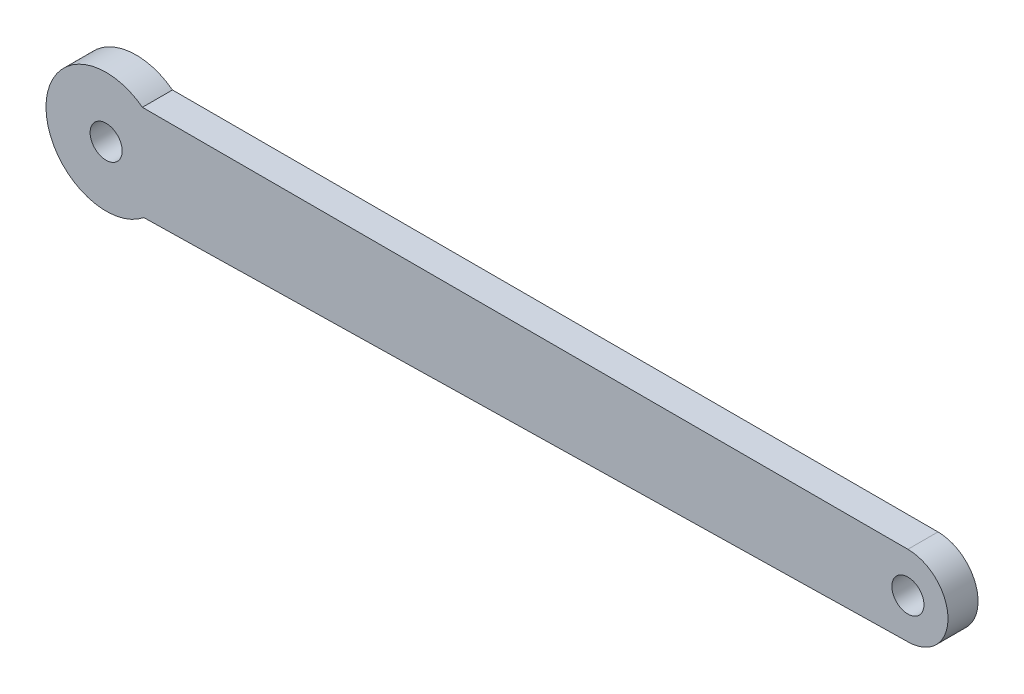
ISO-10303-21;
HEADER;
FILE_DESCRIPTION(('STEP AP214'),'2;1');
FILE_NAME('part.step','',(''),(''),'','','');
FILE_SCHEMA(('AUTOMOTIVE_DESIGN { 1 0 10303 214 1 1 1 1 }'));
ENDSEC;
DATA;
#1=APPLICATION_CONTEXT('core data for automotive mechanical design processes');
#2=APPLICATION_PROTOCOL_DEFINITION('international standard','automotive_design',2000,#1);
#3=PRODUCT_CONTEXT('',#1,'mechanical');
#4=PRODUCT('Part','Part','',(#3));
#5=PRODUCT_RELATED_PRODUCT_CATEGORY('part','',(#4));
#6=PRODUCT_DEFINITION_FORMATION('','',#4);
#7=PRODUCT_DEFINITION_CONTEXT('part definition',#1,'design');
#8=PRODUCT_DEFINITION('design','',#6,#7);
#9=PRODUCT_DEFINITION_SHAPE('','',#8);
#10=(LENGTH_UNIT() NAMED_UNIT(*) SI_UNIT(.MILLI.,.METRE.));
#11=(NAMED_UNIT(*) PLANE_ANGLE_UNIT() SI_UNIT($,.RADIAN.));
#12=(NAMED_UNIT(*) SI_UNIT($,.STERADIAN.) SOLID_ANGLE_UNIT());
#13=UNCERTAINTY_MEASURE_WITH_UNIT(LENGTH_MEASURE(1.E-05),#10,'distance_accuracy_value','');
#14=(GEOMETRIC_REPRESENTATION_CONTEXT(3) GLOBAL_UNCERTAINTY_ASSIGNED_CONTEXT((#13)) GLOBAL_UNIT_ASSIGNED_CONTEXT((#10,
#11,#12)) REPRESENTATION_CONTEXT('',''));
#15=CARTESIAN_POINT('',(0.,0.,0.));
#16=DIRECTION('',(0.,0.,1.));
#17=DIRECTION('',(1.,0.,0.));
#18=AXIS2_PLACEMENT_3D('',#15,#16,#17);
#19=CARTESIAN_POINT('',(23.7780144937734,4.4677230475596,0.));
#20=DIRECTION('',(0.,0.,1.));
#21=DIRECTION('',(1.,0.,0.));
#22=AXIS2_PLACEMENT_3D('',#19,#20,#21);
#23=CYLINDRICAL_SURFACE('',#22,3.99989993808305);
#24=CARTESIAN_POINT('',(23.7780144937734,4.4677230475596,3.));
#25=DIRECTION('',(0.,0.,1.));
#26=DIRECTION('',(1.,0.,0.));
#27=AXIS2_PLACEMENT_3D('',#24,#25,#26);
#28=CIRCLE('',#27,3.99989993808305);
#29=CARTESIAN_POINT('',(23.8565670172786,0.468594515525692,3.));
#30=VERTEX_POINT('',#29);
#31=CARTESIAN_POINT('',(23.7780164591369,8.46762298564218,3.));
#32=VERTEX_POINT('',#31);
#33=EDGE_CURVE('E110',#30,#32,#28,.T.);
#34=ORIENTED_EDGE('',*,*,#33,.F.);
#35=DIRECTION('',(0.,0.,1.));
#36=VECTOR('',#35,1.);
#37=CARTESIAN_POINT('',(23.8565670172786,0.468594515525692,0.));
#38=LINE('',#37,#36);
#39=CARTESIAN_POINT('',(23.8565670172786,0.468594515525692,0.));
#40=VERTEX_POINT('',#39);
#41=EDGE_CURVE('E11',#40,#30,#38,.T.);
#42=ORIENTED_EDGE('',*,*,#41,.F.);
#43=CARTESIAN_POINT('',(23.7780144937734,4.4677230475596,0.));
#44=DIRECTION('',(0.,0.,1.));
#45=DIRECTION('',(1.,0.,0.));
#46=AXIS2_PLACEMENT_3D('',#43,#44,#45);
#47=CIRCLE('',#46,3.99989993808305);
#48=CARTESIAN_POINT('',(23.7780164591369,8.46762298564218,0.));
#49=VERTEX_POINT('',#48);
#50=EDGE_CURVE('E101',#40,#49,#47,.T.);
#51=ORIENTED_EDGE('',*,*,#50,.T.);
#52=DIRECTION('',(0.,0.,1.));
#53=VECTOR('',#52,1.);
#54=CARTESIAN_POINT('',(23.7780164591369,8.46762298564218,0.));
#55=LINE('',#54,#53);
#56=EDGE_CURVE('E42',#49,#32,#55,.T.);
#57=ORIENTED_EDGE('',*,*,#56,.T.);
#58=EDGE_LOOP('',(#34,#42,#51,#57));
#59=FACE_BOUND('',#58,.T.);
#60=ADVANCED_FACE('F39',(#59),#23,.T.);
#61=CARTESIAN_POINT('',(-52.4516036256297,-0.990377004711713,0.));
#62=DIRECTION('',(0.019115972963264,-0.999817273094273,0.));
#63=DIRECTION('',(0.999817273094273,0.019115972963264,0.));
#64=AXIS2_PLACEMENT_3D('',#61,#62,#63);
#65=PLANE('',#64);
#66=DIRECTION('',(0.999817273094273,0.019115972963264,0.));
#67=VECTOR('',#66,1.);
#68=CARTESIAN_POINT('',(-52.4516036256297,-0.990377004711713,3.));
#69=LINE('',#68,#67);
#70=CARTESIAN_POINT('',(-52.4516036256296,-0.990377004711735,3.));
#71=VERTEX_POINT('',#70);
#72=EDGE_CURVE('E104',#71,#30,#69,.T.);
#73=ORIENTED_EDGE('',*,*,#72,.F.);
#74=DIRECTION('',(0.,0.,1.));
#75=VECTOR('',#74,1.);
#76=CARTESIAN_POINT('',(-52.4516036256296,-0.990377004711735,0.));
#77=LINE('',#76,#75);
#78=CARTESIAN_POINT('',(-52.4516036256296,-0.990377004711735,0.));
#79=VERTEX_POINT('',#78);
#80=EDGE_CURVE('E49',#79,#71,#77,.T.);
#81=ORIENTED_EDGE('',*,*,#80,.F.);
#82=DIRECTION('',(0.999817273094273,0.019115972963264,0.));
#83=VECTOR('',#82,1.);
#84=CARTESIAN_POINT('',(-52.4516036256297,-0.990377004711713,0.));
#85=LINE('',#84,#83);
#86=EDGE_CURVE('E96',#79,#40,#85,.T.);
#87=ORIENTED_EDGE('',*,*,#86,.T.);
#88=ORIENTED_EDGE('',*,*,#41,.T.);
#89=EDGE_LOOP('',(#73,#81,#87,#88));
#90=FACE_BOUND('',#89,.T.);
#91=ADVANCED_FACE('F127',(#90),#65,.T.);
#92=CARTESIAN_POINT('',(-56.215610459493,3.68212259985001,0.));
#93=DIRECTION('',(0.,0.,1.));
#94=DIRECTION('',(1.,0.,0.));
#95=AXIS2_PLACEMENT_3D('',#92,#93,#94);
#96=CYLINDRICAL_SURFACE('',#95,5.99999999999998);
#97=CARTESIAN_POINT('',(-56.215610459493,3.68212259985001,3.));
#98=DIRECTION('',(0.,0.,1.));
#99=DIRECTION('',(1.,0.,0.));
#100=AXIS2_PLACEMENT_3D('',#97,#98,#99);
#101=CIRCLE('',#100,5.99999999999998);
#102=CARTESIAN_POINT('',(-52.5963583188453,8.46762298564217,3.));
#103=VERTEX_POINT('',#102);
#104=EDGE_CURVE('E90',#103,#71,#101,.T.);
#105=ORIENTED_EDGE('',*,*,#104,.F.);
#106=DIRECTION('',(0.,0.,1.));
#107=VECTOR('',#106,1.);
#108=CARTESIAN_POINT('',(-52.5963583188453,8.46762298564217,0.));
#109=LINE('',#108,#107);
#110=CARTESIAN_POINT('',(-52.5963583188453,8.46762298564217,0.));
#111=VERTEX_POINT('',#110);
#112=EDGE_CURVE('E85',#111,#103,#109,.T.);
#113=ORIENTED_EDGE('',*,*,#112,.F.);
#114=CARTESIAN_POINT('',(-56.215610459493,3.68212259985001,0.));
#115=DIRECTION('',(0.,0.,1.));
#116=DIRECTION('',(1.,0.,0.));
#117=AXIS2_PLACEMENT_3D('',#114,#115,#116);
#118=CIRCLE('',#117,5.99999999999998);
#119=EDGE_CURVE('E88',#111,#79,#118,.T.);
#120=ORIENTED_EDGE('',*,*,#119,.T.);
#121=ORIENTED_EDGE('',*,*,#80,.T.);
#122=EDGE_LOOP('',(#105,#113,#120,#121));
#123=FACE_BOUND('',#122,.T.);
#124=ADVANCED_FACE('F87',(#123),#96,.T.);
#125=CARTESIAN_POINT('',(23.7780164591369,8.46762298564218,0.));
#126=DIRECTION('',(0.,1.,0.));
#127=DIRECTION('',(-1.,0.,0.));
#128=AXIS2_PLACEMENT_3D('',#125,#126,#127);
#129=PLANE('',#128);
#130=DIRECTION('',(-1.,0.,0.));
#131=VECTOR('',#130,1.);
#132=CARTESIAN_POINT('',(23.7780164591369,8.46762298564218,3.));
#133=LINE('',#132,#131);
#134=EDGE_CURVE('E114',#32,#103,#133,.T.);
#135=ORIENTED_EDGE('',*,*,#134,.F.);
#136=ORIENTED_EDGE('',*,*,#56,.F.);
#137=DIRECTION('',(-1.,0.,0.));
#138=VECTOR('',#137,1.);
#139=CARTESIAN_POINT('',(23.7780164591369,8.46762298564218,0.));
#140=LINE('',#139,#138);
#141=EDGE_CURVE('E95',#49,#111,#140,.T.);
#142=ORIENTED_EDGE('',*,*,#141,.T.);
#143=ORIENTED_EDGE('',*,*,#112,.T.);
#144=EDGE_LOOP('',(#135,#136,#142,#143));
#145=FACE_BOUND('',#144,.T.);
#146=ADVANCED_FACE('F99',(#145),#129,.T.);
#147=CARTESIAN_POINT('',(23.7780144937734,4.4677230475596,0.));
#148=DIRECTION('',(0.,0.,1.));
#149=DIRECTION('',(1.,0.,0.));
#150=AXIS2_PLACEMENT_3D('',#147,#148,#149);
#151=PLANE('',#150);
#152=CARTESIAN_POINT('',(-56.2156099686105,3.68212299528828,0.));
#153=DIRECTION('',(0.,0.,1.));
#154=DIRECTION('',(1.,0.,0.));
#155=AXIS2_PLACEMENT_3D('',#152,#153,#154);
#156=CIRCLE('',#155,1.6);
#157=CARTESIAN_POINT('',(-54.6156099686105,3.68212299528828,0.));
#158=VERTEX_POINT('',#157);
#159=EDGE_CURVE('E115',#158,#158,#156,.T.);
#160=ORIENTED_EDGE('',*,*,#159,.T.);
#161=EDGE_LOOP('',(#160));
#162=FACE_BOUND('',#161,.T.);
#163=CARTESIAN_POINT('',(23.7780174551179,4.4678231769752,0.));
#164=DIRECTION('',(0.,0.,1.));
#165=DIRECTION('',(1.,0.,0.));
#166=AXIS2_PLACEMENT_3D('',#163,#164,#165);
#167=CIRCLE('',#166,1.6);
#168=CARTESIAN_POINT('',(25.3780174551179,4.4678231769752,0.));
#169=VERTEX_POINT('',#168);
#170=EDGE_CURVE('E164',#169,#169,#167,.T.);
#171=ORIENTED_EDGE('',*,*,#170,.T.);
#172=EDGE_LOOP('',(#171));
#173=FACE_BOUND('',#172,.T.);
#174=ORIENTED_EDGE('',*,*,#50,.F.);
#175=ORIENTED_EDGE('',*,*,#86,.F.);
#176=ORIENTED_EDGE('',*,*,#119,.F.);
#177=ORIENTED_EDGE('',*,*,#141,.F.);
#178=EDGE_LOOP('',(#174,#175,#176,#177));
#179=FACE_BOUND('',#178,.T.);
#180=ADVANCED_FACE('F94',(#162,#173,#179),#151,.F.);
#181=CARTESIAN_POINT('',(23.7780144937734,4.4677230475596,3.));
#182=DIRECTION('',(0.,0.,1.));
#183=DIRECTION('',(1.,0.,0.));
#184=AXIS2_PLACEMENT_3D('',#181,#182,#183);
#185=PLANE('',#184);
#186=CARTESIAN_POINT('',(-56.2156099686105,3.68212299528828,3.));
#187=DIRECTION('',(0.,0.,1.));
#188=DIRECTION('',(1.,0.,0.));
#189=AXIS2_PLACEMENT_3D('',#186,#187,#188);
#190=CIRCLE('',#189,1.6);
#191=CARTESIAN_POINT('',(-54.6156099686105,3.68212299528828,3.));
#192=VERTEX_POINT('',#191);
#193=EDGE_CURVE('E162',#192,#192,#190,.T.);
#194=ORIENTED_EDGE('',*,*,#193,.F.);
#195=EDGE_LOOP('',(#194));
#196=FACE_BOUND('',#195,.T.);
#197=CARTESIAN_POINT('',(23.7780174551179,4.4678231769752,3.));
#198=DIRECTION('',(0.,0.,1.));
#199=DIRECTION('',(1.,0.,0.));
#200=AXIS2_PLACEMENT_3D('',#197,#198,#199);
#201=CIRCLE('',#200,1.6);
#202=CARTESIAN_POINT('',(25.3780174551179,4.4678231769752,3.));
#203=VERTEX_POINT('',#202);
#204=EDGE_CURVE('E170',#203,#203,#201,.T.);
#205=ORIENTED_EDGE('',*,*,#204,.F.);
#206=EDGE_LOOP('',(#205));
#207=FACE_BOUND('',#206,.T.);
#208=ORIENTED_EDGE('',*,*,#33,.T.);
#209=ORIENTED_EDGE('',*,*,#134,.T.);
#210=ORIENTED_EDGE('',*,*,#104,.T.);
#211=ORIENTED_EDGE('',*,*,#72,.T.);
#212=EDGE_LOOP('',(#208,#209,#210,#211));
#213=FACE_BOUND('',#212,.T.);
#214=ADVANCED_FACE('F126',(#196,#207,#213),#185,.T.);
#215=CARTESIAN_POINT('',(23.7780174551179,4.4678231769752,0.));
#216=DIRECTION('',(0.,0.,1.));
#217=DIRECTION('',(1.,0.,0.));
#218=AXIS2_PLACEMENT_3D('',#215,#216,#217);
#219=CYLINDRICAL_SURFACE('',#218,1.6);
#220=ORIENTED_EDGE('',*,*,#170,.F.);
#221=EDGE_LOOP('',(#220));
#222=FACE_BOUND('',#221,.T.);
#223=ORIENTED_EDGE('',*,*,#204,.T.);
#224=EDGE_LOOP('',(#223));
#225=FACE_BOUND('',#224,.T.);
#226=ADVANCED_FACE('F145',(#222,#225),#219,.F.);
#227=CARTESIAN_POINT('',(-56.2156099686105,3.68212299528828,0.));
#228=DIRECTION('',(0.,0.,1.));
#229=DIRECTION('',(1.,0.,0.));
#230=AXIS2_PLACEMENT_3D('',#227,#228,#229);
#231=CYLINDRICAL_SURFACE('',#230,1.6);
#232=ORIENTED_EDGE('',*,*,#159,.F.);
#233=EDGE_LOOP('',(#232));
#234=FACE_BOUND('',#233,.T.);
#235=ORIENTED_EDGE('',*,*,#193,.T.);
#236=EDGE_LOOP('',(#235));
#237=FACE_BOUND('',#236,.T.);
#238=ADVANCED_FACE('F152',(#234,#237),#231,.F.);
#239=CLOSED_SHELL('',(#60,#91,#124,#146,#180,#214,#226,#238));
#240=MANIFOLD_SOLID_BREP('B2',#239);
#241=ADVANCED_BREP_SHAPE_REPRESENTATION('',(#18,#240),#14);
#242=SHAPE_DEFINITION_REPRESENTATION(#9,#241);
ENDSEC;
END-ISO-10303-21;
